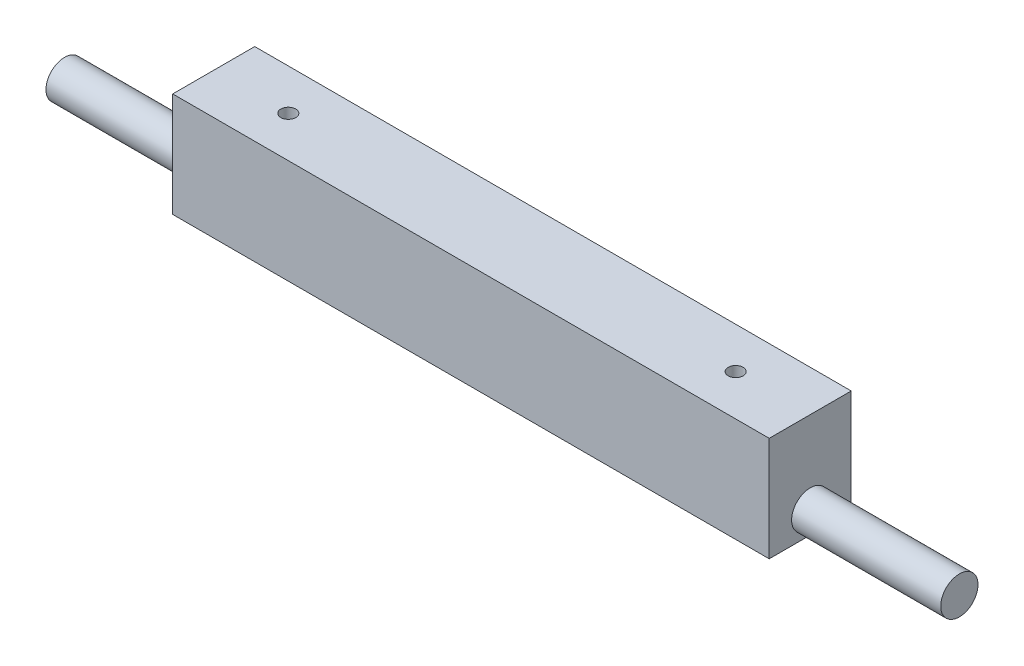
ISO-10303-21;
HEADER;
FILE_DESCRIPTION(('STEP AP214'),'2;1');
FILE_NAME('part.step','',(''),(''),'','','');
FILE_SCHEMA(('AUTOMOTIVE_DESIGN { 1 0 10303 214 1 1 1 1 }'));
ENDSEC;
DATA;
#1=APPLICATION_CONTEXT('core data for automotive mechanical design processes');
#2=APPLICATION_PROTOCOL_DEFINITION('international standard','automotive_design',2000,#1);
#3=PRODUCT_CONTEXT('',#1,'mechanical');
#4=PRODUCT('Part','Part','',(#3));
#5=PRODUCT_RELATED_PRODUCT_CATEGORY('part','',(#4));
#6=PRODUCT_DEFINITION_FORMATION('','',#4);
#7=PRODUCT_DEFINITION_CONTEXT('part definition',#1,'design');
#8=PRODUCT_DEFINITION('design','',#6,#7);
#9=PRODUCT_DEFINITION_SHAPE('','',#8);
#10=(LENGTH_UNIT() NAMED_UNIT(*) SI_UNIT(.MILLI.,.METRE.));
#11=(NAMED_UNIT(*) PLANE_ANGLE_UNIT() SI_UNIT($,.RADIAN.));
#12=(NAMED_UNIT(*) SI_UNIT($,.STERADIAN.) SOLID_ANGLE_UNIT());
#13=UNCERTAINTY_MEASURE_WITH_UNIT(LENGTH_MEASURE(1.E-05),#10,'distance_accuracy_value','');
#14=(GEOMETRIC_REPRESENTATION_CONTEXT(3) GLOBAL_UNCERTAINTY_ASSIGNED_CONTEXT((#13)) GLOBAL_UNIT_ASSIGNED_CONTEXT((#10,
#11,#12)) REPRESENTATION_CONTEXT('',''));
#15=CARTESIAN_POINT('',(0.,0.,0.));
#16=DIRECTION('',(0.,0.,1.));
#17=DIRECTION('',(1.,0.,0.));
#18=AXIS2_PLACEMENT_3D('',#15,#16,#17);
#19=CARTESIAN_POINT('',(300.,0.,0.));
#20=DIRECTION('',(-1.,0.,0.));
#21=DIRECTION('',(0.,0.,1.));
#22=AXIS2_PLACEMENT_3D('',#19,#20,#21);
#23=CYLINDRICAL_SURFACE('',#22,12.5);
#24=CARTESIAN_POINT('',(200.,0.,0.));
#25=DIRECTION('',(1.,0.,0.));
#26=DIRECTION('',(0.,0.,-1.));
#27=AXIS2_PLACEMENT_3D('',#24,#25,#26);
#28=CIRCLE('',#27,12.5);
#29=CARTESIAN_POINT('',(200.,0.,-12.5));
#30=VERTEX_POINT('',#29);
#31=EDGE_CURVE('E50',#30,#30,#28,.T.);
#32=ORIENTED_EDGE('',*,*,#31,.T.);
#33=EDGE_LOOP('',(#32));
#34=FACE_BOUND('',#33,.T.);
#35=CARTESIAN_POINT('',(300.,0.,0.));
#36=DIRECTION('',(1.,0.,0.));
#37=DIRECTION('',(0.,0.,-1.));
#38=AXIS2_PLACEMENT_3D('',#35,#36,#37);
#39=CIRCLE('',#38,12.5);
#40=CARTESIAN_POINT('',(300.,0.,-12.5));
#41=VERTEX_POINT('',#40);
#42=EDGE_CURVE('E57',#41,#41,#39,.T.);
#43=ORIENTED_EDGE('',*,*,#42,.F.);
#44=EDGE_LOOP('',(#43));
#45=FACE_BOUND('',#44,.T.);
#46=ADVANCED_FACE('F47',(#34,#45),#23,.T.);
#47=CARTESIAN_POINT('',(300.,0.,0.));
#48=DIRECTION('',(1.,0.,0.));
#49=DIRECTION('',(0.,0.,-1.));
#50=AXIS2_PLACEMENT_3D('',#47,#48,#49);
#51=PLANE('',#50);
#52=ORIENTED_EDGE('',*,*,#42,.T.);
#53=EDGE_LOOP('',(#52));
#54=FACE_BOUND('',#53,.T.);
#55=ADVANCED_FACE('F167',(#54),#51,.T.);
#56=CARTESIAN_POINT('',(200.,55.,27.5));
#57=DIRECTION('',(0.,0.,-1.));
#58=DIRECTION('',(0.,1.,0.));
#59=AXIS2_PLACEMENT_3D('',#56,#57,#58);
#60=PLANE('',#59);
#61=DIRECTION('',(0.,-1.,0.));
#62=VECTOR('',#61,1.);
#63=CARTESIAN_POINT('',(-200.,55.,27.5));
#64=LINE('',#63,#62);
#65=CARTESIAN_POINT('',(-200.,55.,27.5));
#66=VERTEX_POINT('',#65);
#67=CARTESIAN_POINT('',(-200.,-15.,27.5));
#68=VERTEX_POINT('',#67);
#69=EDGE_CURVE('E120',#66,#68,#64,.T.);
#70=ORIENTED_EDGE('',*,*,#69,.T.);
#71=DIRECTION('',(-1.,0.,0.));
#72=VECTOR('',#71,1.);
#73=CARTESIAN_POINT('',(200.,-15.,27.5));
#74=LINE('',#73,#72);
#75=CARTESIAN_POINT('',(200.,-15.,27.5));
#76=VERTEX_POINT('',#75);
#77=EDGE_CURVE('E109',#76,#68,#74,.T.);
#78=ORIENTED_EDGE('',*,*,#77,.F.);
#79=DIRECTION('',(0.,-1.,0.));
#80=VECTOR('',#79,1.);
#81=CARTESIAN_POINT('',(200.,55.,27.5));
#82=LINE('',#81,#80);
#83=CARTESIAN_POINT('',(200.,55.,27.5));
#84=VERTEX_POINT('',#83);
#85=EDGE_CURVE('E101',#84,#76,#82,.T.);
#86=ORIENTED_EDGE('',*,*,#85,.F.);
#87=DIRECTION('',(-1.,0.,0.));
#88=VECTOR('',#87,1.);
#89=CARTESIAN_POINT('',(200.,55.,27.5));
#90=LINE('',#89,#88);
#91=EDGE_CURVE('E116',#84,#66,#90,.T.);
#92=ORIENTED_EDGE('',*,*,#91,.T.);
#93=EDGE_LOOP('',(#70,#78,#86,#92));
#94=FACE_BOUND('',#93,.T.);
#95=ADVANCED_FACE('F174',(#94),#60,.F.);
#96=CARTESIAN_POINT('',(200.,-15.,27.5));
#97=DIRECTION('',(0.,1.,0.));
#98=DIRECTION('',(0.,0.,1.));
#99=AXIS2_PLACEMENT_3D('',#96,#97,#98);
#100=PLANE('',#99);
#101=CARTESIAN_POINT('',(150.,-15.,0.));
#102=DIRECTION('',(0.,1.,0.));
#103=DIRECTION('',(0.,0.,1.));
#104=AXIS2_PLACEMENT_3D('',#101,#102,#103);
#105=CIRCLE('',#104,4.99999999999999);
#106=CARTESIAN_POINT('',(150.,-15.,4.99999999999999));
#107=VERTEX_POINT('',#106);
#108=EDGE_CURVE('E124',#107,#107,#105,.T.);
#109=ORIENTED_EDGE('',*,*,#108,.T.);
#110=EDGE_LOOP('',(#109));
#111=FACE_BOUND('',#110,.T.);
#112=CARTESIAN_POINT('',(-150.,-15.,0.));
#113=DIRECTION('',(0.,1.,0.));
#114=DIRECTION('',(0.,0.,-1.));
#115=AXIS2_PLACEMENT_3D('',#112,#113,#114);
#116=CIRCLE('',#115,4.99999999999999);
#117=CARTESIAN_POINT('',(-150.,-15.,-4.99999999999999));
#118=VERTEX_POINT('',#117);
#119=EDGE_CURVE('E193',#118,#118,#116,.T.);
#120=ORIENTED_EDGE('',*,*,#119,.T.);
#121=EDGE_LOOP('',(#120));
#122=FACE_BOUND('',#121,.T.);
#123=DIRECTION('',(0.,0.,-1.));
#124=VECTOR('',#123,1.);
#125=CARTESIAN_POINT('',(-200.,-15.,27.5));
#126=LINE('',#125,#124);
#127=CARTESIAN_POINT('',(-200.,-15.,-27.5));
#128=VERTEX_POINT('',#127);
#129=EDGE_CURVE('E107',#68,#128,#126,.T.);
#130=ORIENTED_EDGE('',*,*,#129,.T.);
#131=DIRECTION('',(-1.,0.,0.));
#132=VECTOR('',#131,1.);
#133=CARTESIAN_POINT('',(200.,-15.,-27.5));
#134=LINE('',#133,#132);
#135=CARTESIAN_POINT('',(200.,-15.,-27.5));
#136=VERTEX_POINT('',#135);
#137=EDGE_CURVE('E105',#136,#128,#134,.T.);
#138=ORIENTED_EDGE('',*,*,#137,.F.);
#139=DIRECTION('',(0.,0.,-1.));
#140=VECTOR('',#139,1.);
#141=CARTESIAN_POINT('',(200.,-15.,27.5));
#142=LINE('',#141,#140);
#143=EDGE_CURVE('E96',#76,#136,#142,.T.);
#144=ORIENTED_EDGE('',*,*,#143,.F.);
#145=ORIENTED_EDGE('',*,*,#77,.T.);
#146=EDGE_LOOP('',(#130,#138,#144,#145));
#147=FACE_BOUND('',#146,.T.);
#148=ADVANCED_FACE('F106',(#111,#122,#147),#100,.F.);
#149=CARTESIAN_POINT('',(200.,55.,-27.5));
#150=DIRECTION('',(0.,0.,1.));
#151=DIRECTION('',(0.,-1.,0.));
#152=AXIS2_PLACEMENT_3D('',#149,#150,#151);
#153=PLANE('',#152);
#154=DIRECTION('',(0.,1.,0.));
#155=VECTOR('',#154,1.);
#156=CARTESIAN_POINT('',(-200.,55.,-27.5));
#157=LINE('',#156,#155);
#158=CARTESIAN_POINT('',(-200.,55.,-27.5));
#159=VERTEX_POINT('',#158);
#160=EDGE_CURVE('E82',#128,#159,#157,.T.);
#161=ORIENTED_EDGE('',*,*,#160,.T.);
#162=DIRECTION('',(-1.,0.,0.));
#163=VECTOR('',#162,1.);
#164=CARTESIAN_POINT('',(200.,55.,-27.5));
#165=LINE('',#164,#163);
#166=CARTESIAN_POINT('',(200.,55.,-27.5));
#167=VERTEX_POINT('',#166);
#168=EDGE_CURVE('E110',#167,#159,#165,.T.);
#169=ORIENTED_EDGE('',*,*,#168,.F.);
#170=DIRECTION('',(0.,1.,0.));
#171=VECTOR('',#170,1.);
#172=CARTESIAN_POINT('',(200.,55.,-27.5));
#173=LINE('',#172,#171);
#174=EDGE_CURVE('E99',#136,#167,#173,.T.);
#175=ORIENTED_EDGE('',*,*,#174,.F.);
#176=ORIENTED_EDGE('',*,*,#137,.T.);
#177=EDGE_LOOP('',(#161,#169,#175,#176));
#178=FACE_BOUND('',#177,.T.);
#179=ADVANCED_FACE('F112',(#178),#153,.F.);
#180=CARTESIAN_POINT('',(200.,55.,27.5));
#181=DIRECTION('',(0.,-1.,0.));
#182=DIRECTION('',(0.,0.,-1.));
#183=AXIS2_PLACEMENT_3D('',#180,#181,#182);
#184=PLANE('',#183);
#185=CARTESIAN_POINT('',(150.,55.,0.));
#186=DIRECTION('',(0.,1.,0.));
#187=DIRECTION('',(0.,0.,1.));
#188=AXIS2_PLACEMENT_3D('',#185,#186,#187);
#189=CIRCLE('',#188,4.99999999999999);
#190=CARTESIAN_POINT('',(150.,55.,4.99999999999999));
#191=VERTEX_POINT('',#190);
#192=EDGE_CURVE('E201',#191,#191,#189,.T.);
#193=ORIENTED_EDGE('',*,*,#192,.F.);
#194=EDGE_LOOP('',(#193));
#195=FACE_BOUND('',#194,.T.);
#196=CARTESIAN_POINT('',(-150.,55.,0.));
#197=DIRECTION('',(0.,1.,0.));
#198=DIRECTION('',(0.,0.,-1.));
#199=AXIS2_PLACEMENT_3D('',#196,#197,#198);
#200=CIRCLE('',#199,4.99999999999999);
#201=CARTESIAN_POINT('',(-150.,55.,-4.99999999999998));
#202=VERTEX_POINT('',#201);
#203=EDGE_CURVE('E197',#202,#202,#200,.T.);
#204=ORIENTED_EDGE('',*,*,#203,.F.);
#205=EDGE_LOOP('',(#204));
#206=FACE_BOUND('',#205,.T.);
#207=DIRECTION('',(0.,0.,1.));
#208=VECTOR('',#207,1.);
#209=CARTESIAN_POINT('',(-200.,55.,27.5));
#210=LINE('',#209,#208);
#211=EDGE_CURVE('E88',#159,#66,#210,.T.);
#212=ORIENTED_EDGE('',*,*,#211,.T.);
#213=ORIENTED_EDGE('',*,*,#91,.F.);
#214=DIRECTION('',(0.,0.,1.));
#215=VECTOR('',#214,1.);
#216=CARTESIAN_POINT('',(200.,55.,27.5));
#217=LINE('',#216,#215);
#218=EDGE_CURVE('E65',#167,#84,#217,.T.);
#219=ORIENTED_EDGE('',*,*,#218,.F.);
#220=ORIENTED_EDGE('',*,*,#168,.T.);
#221=EDGE_LOOP('',(#212,#213,#219,#220));
#222=FACE_BOUND('',#221,.T.);
#223=ADVANCED_FACE('F153',(#195,#206,#222),#184,.F.);
#224=CARTESIAN_POINT('',(200.,0.,0.));
#225=DIRECTION('',(1.,0.,0.));
#226=DIRECTION('',(0.,0.,-1.));
#227=AXIS2_PLACEMENT_3D('',#224,#225,#226);
#228=PLANE('',#227);
#229=ORIENTED_EDGE('',*,*,#31,.F.);
#230=EDGE_LOOP('',(#229));
#231=FACE_BOUND('',#230,.T.);
#232=ORIENTED_EDGE('',*,*,#85,.T.);
#233=ORIENTED_EDGE('',*,*,#143,.T.);
#234=ORIENTED_EDGE('',*,*,#174,.T.);
#235=ORIENTED_EDGE('',*,*,#218,.T.);
#236=EDGE_LOOP('',(#232,#233,#234,#235));
#237=FACE_BOUND('',#236,.T.);
#238=ADVANCED_FACE('F97',(#231,#237),#228,.T.);
#239=CARTESIAN_POINT('',(-200.,0.,0.));
#240=DIRECTION('',(1.,0.,0.));
#241=DIRECTION('',(0.,0.,-1.));
#242=AXIS2_PLACEMENT_3D('',#239,#240,#241);
#243=PLANE('',#242);
#244=CARTESIAN_POINT('',(-200.,0.,0.));
#245=DIRECTION('',(1.,0.,0.));
#246=DIRECTION('',(0.,0.,-1.));
#247=AXIS2_PLACEMENT_3D('',#244,#245,#246);
#248=CIRCLE('',#247,12.5);
#249=CARTESIAN_POINT('',(-200.,0.,-12.5));
#250=VERTEX_POINT('',#249);
#251=EDGE_CURVE('E11',#250,#250,#248,.T.);
#252=ORIENTED_EDGE('',*,*,#251,.T.);
#253=EDGE_LOOP('',(#252));
#254=FACE_BOUND('',#253,.T.);
#255=ORIENTED_EDGE('',*,*,#69,.F.);
#256=ORIENTED_EDGE('',*,*,#211,.F.);
#257=ORIENTED_EDGE('',*,*,#160,.F.);
#258=ORIENTED_EDGE('',*,*,#129,.F.);
#259=EDGE_LOOP('',(#255,#256,#257,#258));
#260=FACE_BOUND('',#259,.T.);
#261=ADVANCED_FACE('F152',(#254,#260),#243,.F.);
#262=CARTESIAN_POINT('',(-300.,0.,0.));
#263=DIRECTION('',(1.,0.,0.));
#264=DIRECTION('',(0.,0.,-1.));
#265=AXIS2_PLACEMENT_3D('',#262,#263,#264);
#266=PLANE('',#265);
#267=CARTESIAN_POINT('',(-300.,0.,0.));
#268=DIRECTION('',(1.,0.,0.));
#269=DIRECTION('',(0.,0.,-1.));
#270=AXIS2_PLACEMENT_3D('',#267,#268,#269);
#271=CIRCLE('',#270,12.5);
#272=CARTESIAN_POINT('',(-300.,0.,-12.5));
#273=VERTEX_POINT('',#272);
#274=EDGE_CURVE('E140',#273,#273,#271,.T.);
#275=ORIENTED_EDGE('',*,*,#274,.F.);
#276=EDGE_LOOP('',(#275));
#277=FACE_BOUND('',#276,.T.);
#278=ADVANCED_FACE('F159',(#277),#266,.F.);
#279=ORIENTED_EDGE('',*,*,#274,.T.);
#280=EDGE_LOOP('',(#279));
#281=FACE_BOUND('',#280,.T.);
#282=ORIENTED_EDGE('',*,*,#251,.F.);
#283=EDGE_LOOP('',(#282));
#284=FACE_BOUND('',#283,.T.);
#285=ADVANCED_FACE('F168',(#281,#284),#23,.T.);
#286=CARTESIAN_POINT('',(-150.,-15.,0.));
#287=DIRECTION('',(0.,1.,0.));
#288=DIRECTION('',(0.,0.,1.));
#289=AXIS2_PLACEMENT_3D('',#286,#287,#288);
#290=CYLINDRICAL_SURFACE('',#289,4.99999999999999);
#291=ORIENTED_EDGE('',*,*,#119,.F.);
#292=EDGE_LOOP('',(#291));
#293=FACE_BOUND('',#292,.T.);
#294=ORIENTED_EDGE('',*,*,#203,.T.);
#295=EDGE_LOOP('',(#294));
#296=FACE_BOUND('',#295,.T.);
#297=ADVANCED_FACE('F178',(#293,#296),#290,.F.);
#298=CARTESIAN_POINT('',(150.,-15.,0.));
#299=DIRECTION('',(0.,1.,0.));
#300=DIRECTION('',(0.,0.,1.));
#301=AXIS2_PLACEMENT_3D('',#298,#299,#300);
#302=CYLINDRICAL_SURFACE('',#301,4.99999999999999);
#303=ORIENTED_EDGE('',*,*,#108,.F.);
#304=EDGE_LOOP('',(#303));
#305=FACE_BOUND('',#304,.T.);
#306=ORIENTED_EDGE('',*,*,#192,.T.);
#307=EDGE_LOOP('',(#306));
#308=FACE_BOUND('',#307,.T.);
#309=ADVANCED_FACE('F183',(#305,#308),#302,.F.);
#310=CLOSED_SHELL('',(#46,#55,#95,#148,#179,#223,#238,#261,#278,#285,#297,#309));
#311=MANIFOLD_SOLID_BREP('B2',#310);
#312=ADVANCED_BREP_SHAPE_REPRESENTATION('',(#18,#311),#14);
#313=SHAPE_DEFINITION_REPRESENTATION(#9,#312);
ENDSEC;
END-ISO-10303-21;
